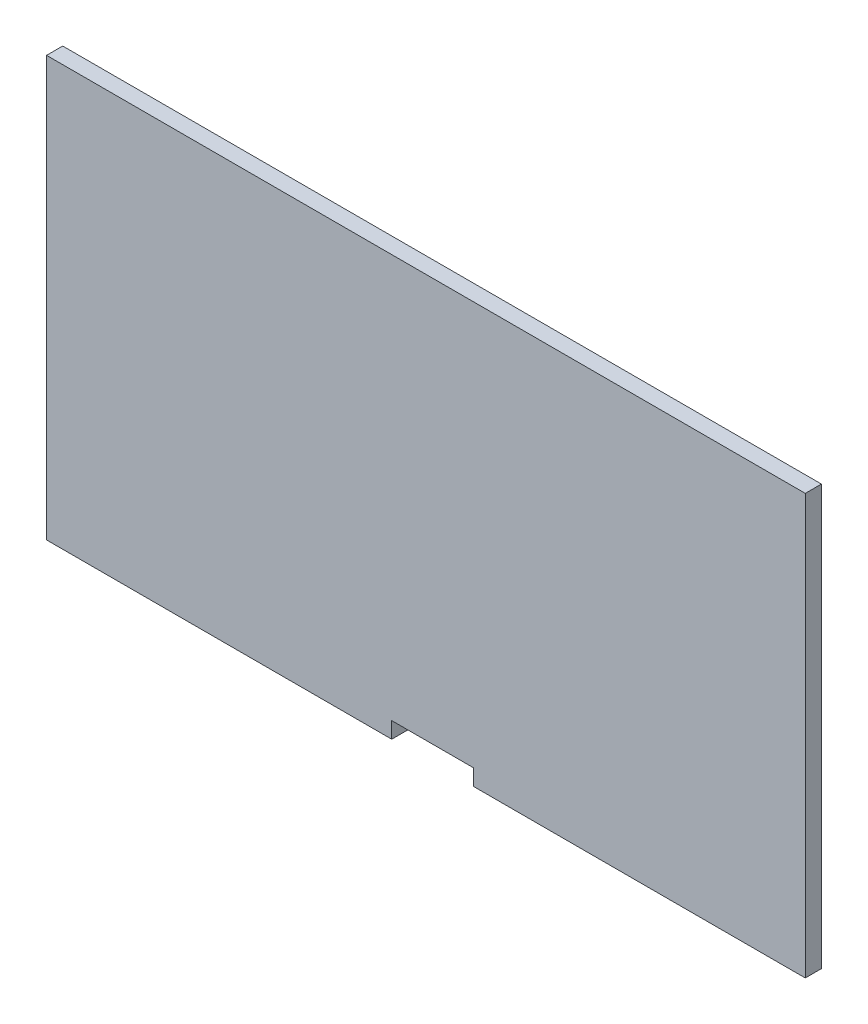
ISO-10303-21;
HEADER;
FILE_DESCRIPTION(('STEP AP214'),'2;1');
FILE_NAME('part.step','',(''),(''),'','','');
FILE_SCHEMA(('AUTOMOTIVE_DESIGN { 1 0 10303 214 1 1 1 1 }'));
ENDSEC;
DATA;
#1=APPLICATION_CONTEXT('core data for automotive mechanical design processes');
#2=APPLICATION_PROTOCOL_DEFINITION('international standard','automotive_design',2000,#1);
#3=PRODUCT_CONTEXT('',#1,'mechanical');
#4=PRODUCT('Part','Part','',(#3));
#5=PRODUCT_RELATED_PRODUCT_CATEGORY('part','',(#4));
#6=PRODUCT_DEFINITION_FORMATION('','',#4);
#7=PRODUCT_DEFINITION_CONTEXT('part definition',#1,'design');
#8=PRODUCT_DEFINITION('design','',#6,#7);
#9=PRODUCT_DEFINITION_SHAPE('','',#8);
#10=(LENGTH_UNIT() NAMED_UNIT(*) SI_UNIT(.MILLI.,.METRE.));
#11=(NAMED_UNIT(*) PLANE_ANGLE_UNIT() SI_UNIT($,.RADIAN.));
#12=(NAMED_UNIT(*) SI_UNIT($,.STERADIAN.) SOLID_ANGLE_UNIT());
#13=UNCERTAINTY_MEASURE_WITH_UNIT(LENGTH_MEASURE(1.E-05),#10,'distance_accuracy_value','');
#14=(GEOMETRIC_REPRESENTATION_CONTEXT(3) GLOBAL_UNCERTAINTY_ASSIGNED_CONTEXT((#13)) GLOBAL_UNIT_ASSIGNED_CONTEXT((#10,
#11,#12)) REPRESENTATION_CONTEXT('',''));
#15=CARTESIAN_POINT('',(0.,0.,0.));
#16=DIRECTION('',(0.,0.,1.));
#17=DIRECTION('',(1.,0.,0.));
#18=AXIS2_PLACEMENT_3D('',#15,#16,#17);
#19=CARTESIAN_POINT('',(21.556960057255,0.,41.9590420054778));
#20=DIRECTION('',(1.,0.,0.));
#21=DIRECTION('',(0.,1.,0.));
#22=AXIS2_PLACEMENT_3D('',#19,#20,#21);
#23=PLANE('',#22);
#24=DIRECTION('',(0.,-1.,0.));
#25=VECTOR('',#24,1.);
#26=CARTESIAN_POINT('',(21.556960057255,0.,40.9590420054778));
#27=LINE('',#26,#25);
#28=CARTESIAN_POINT('',(21.556960057255,13.703029385592,40.9590420054778));
#29=VERTEX_POINT('',#28);
#30=CARTESIAN_POINT('',(21.556960057255,12.703029385592,40.9590420054778));
#31=VERTEX_POINT('',#30);
#32=EDGE_CURVE('E145',#29,#31,#27,.T.);
#33=ORIENTED_EDGE('',*,*,#32,.T.);
#34=DIRECTION('',(0.,0.,-1.));
#35=VECTOR('',#34,1.);
#36=CARTESIAN_POINT('',(21.556960057255,12.703029385592,41.9590420054778));
#37=LINE('',#36,#35);
#38=CARTESIAN_POINT('',(21.556960057255,12.703029385592,41.9590420054778));
#39=VERTEX_POINT('',#38);
#40=EDGE_CURVE('E41',#39,#31,#37,.T.);
#41=ORIENTED_EDGE('',*,*,#40,.F.);
#42=DIRECTION('',(0.,-1.,0.));
#43=VECTOR('',#42,1.);
#44=CARTESIAN_POINT('',(21.556960057255,0.,41.9590420054778));
#45=LINE('',#44,#43);
#46=CARTESIAN_POINT('',(21.556960057255,13.703029385592,41.9590420054778));
#47=VERTEX_POINT('',#46);
#48=EDGE_CURVE('E99',#47,#39,#45,.T.);
#49=ORIENTED_EDGE('',*,*,#48,.F.);
#50=DIRECTION('',(0.,0.,-1.));
#51=VECTOR('',#50,1.);
#52=CARTESIAN_POINT('',(21.556960057255,13.703029385592,41.9590420054778));
#53=LINE('',#52,#51);
#54=EDGE_CURVE('E11',#47,#29,#53,.T.);
#55=ORIENTED_EDGE('',*,*,#54,.T.);
#56=EDGE_LOOP('',(#33,#41,#49,#55));
#57=FACE_BOUND('',#56,.T.);
#58=ADVANCED_FACE('F33',(#57),#23,.F.);
#59=CARTESIAN_POINT('',(0.,12.703029385592,41.9590420054778));
#60=DIRECTION('',(0.,1.,0.));
#61=DIRECTION('',(0.,0.,1.));
#62=AXIS2_PLACEMENT_3D('',#59,#60,#61);
#63=PLANE('',#62);
#64=DIRECTION('',(1.,0.,0.));
#65=VECTOR('',#64,1.);
#66=CARTESIAN_POINT('',(0.,12.703029385592,40.9590420054778));
#67=LINE('',#66,#65);
#68=CARTESIAN_POINT('',(42.1130982354382,12.703029385592,40.9590420054778));
#69=VERTEX_POINT('',#68);
#70=EDGE_CURVE('E148',#31,#69,#67,.T.);
#71=ORIENTED_EDGE('',*,*,#70,.T.);
#72=DIRECTION('',(0.,0.,-1.));
#73=VECTOR('',#72,1.);
#74=CARTESIAN_POINT('',(42.1130982354382,12.703029385592,41.9590420054778));
#75=LINE('',#74,#73);
#76=CARTESIAN_POINT('',(42.1130982354382,12.703029385592,41.9590420054778));
#77=VERTEX_POINT('',#76);
#78=EDGE_CURVE('E175',#77,#69,#75,.T.);
#79=ORIENTED_EDGE('',*,*,#78,.F.);
#80=DIRECTION('',(1.,0.,0.));
#81=VECTOR('',#80,1.);
#82=CARTESIAN_POINT('',(0.,12.703029385592,41.9590420054778));
#83=LINE('',#82,#81);
#84=EDGE_CURVE('E183',#39,#77,#83,.T.);
#85=ORIENTED_EDGE('',*,*,#84,.F.);
#86=ORIENTED_EDGE('',*,*,#40,.T.);
#87=EDGE_LOOP('',(#71,#79,#85,#86));
#88=FACE_BOUND('',#87,.T.);
#89=ADVANCED_FACE('F181',(#88),#63,.F.);
#90=CARTESIAN_POINT('',(42.1130982354382,0.,41.9590420054778));
#91=DIRECTION('',(-1.,0.,0.));
#92=DIRECTION('',(0.,0.,1.));
#93=AXIS2_PLACEMENT_3D('',#90,#91,#92);
#94=PLANE('',#93);
#95=DIRECTION('',(0.,1.,0.));
#96=VECTOR('',#95,1.);
#97=CARTESIAN_POINT('',(42.1130982354382,0.,40.9590420054778));
#98=LINE('',#97,#96);
#99=CARTESIAN_POINT('',(42.1130982354382,38.703029385592,40.9590420054778));
#100=VERTEX_POINT('',#99);
#101=EDGE_CURVE('E150',#69,#100,#98,.T.);
#102=ORIENTED_EDGE('',*,*,#101,.T.);
#103=DIRECTION('',(0.,0.,-1.));
#104=VECTOR('',#103,1.);
#105=CARTESIAN_POINT('',(42.1130982354382,38.703029385592,41.9590420054778));
#106=LINE('',#105,#104);
#107=CARTESIAN_POINT('',(42.1130982354382,38.703029385592,41.9590420054778));
#108=VERTEX_POINT('',#107);
#109=EDGE_CURVE('E172',#108,#100,#106,.T.);
#110=ORIENTED_EDGE('',*,*,#109,.F.);
#111=DIRECTION('',(0.,1.,0.));
#112=VECTOR('',#111,1.);
#113=CARTESIAN_POINT('',(42.1130982354382,0.,41.9590420054778));
#114=LINE('',#113,#112);
#115=EDGE_CURVE('E193',#77,#108,#114,.T.);
#116=ORIENTED_EDGE('',*,*,#115,.F.);
#117=ORIENTED_EDGE('',*,*,#78,.T.);
#118=EDGE_LOOP('',(#102,#110,#116,#117));
#119=FACE_BOUND('',#118,.T.);
#120=ADVANCED_FACE('F189',(#119),#94,.F.);
#121=CARTESIAN_POINT('',(0.,38.703029385592,41.9590420054778));
#122=DIRECTION('',(0.,-1.,0.));
#123=DIRECTION('',(0.,0.,-1.));
#124=AXIS2_PLACEMENT_3D('',#121,#122,#123);
#125=PLANE('',#124);
#126=DIRECTION('',(-1.,0.,0.));
#127=VECTOR('',#126,1.);
#128=CARTESIAN_POINT('',(0.,38.703029385592,40.9590420054778));
#129=LINE('',#128,#127);
#130=CARTESIAN_POINT('',(-4.88690176456177,38.703029385592,40.9590420054778));
#131=VERTEX_POINT('',#130);
#132=EDGE_CURVE('E152',#100,#131,#129,.T.);
#133=ORIENTED_EDGE('',*,*,#132,.T.);
#134=DIRECTION('',(0.,0.,-1.));
#135=VECTOR('',#134,1.);
#136=CARTESIAN_POINT('',(-4.88690176456177,38.703029385592,41.9590420054778));
#137=LINE('',#136,#135);
#138=CARTESIAN_POINT('',(-4.88690176456177,38.703029385592,41.9590420054778));
#139=VERTEX_POINT('',#138);
#140=EDGE_CURVE('E134',#139,#131,#137,.T.);
#141=ORIENTED_EDGE('',*,*,#140,.F.);
#142=DIRECTION('',(-1.,0.,0.));
#143=VECTOR('',#142,1.);
#144=CARTESIAN_POINT('',(0.,38.703029385592,41.9590420054778));
#145=LINE('',#144,#143);
#146=EDGE_CURVE('E122',#108,#139,#145,.T.);
#147=ORIENTED_EDGE('',*,*,#146,.F.);
#148=ORIENTED_EDGE('',*,*,#109,.T.);
#149=EDGE_LOOP('',(#133,#141,#147,#148));
#150=FACE_BOUND('',#149,.T.);
#151=ADVANCED_FACE('F192',(#150),#125,.F.);
#152=CARTESIAN_POINT('',(-4.88690176456177,0.,41.9590420054778));
#153=DIRECTION('',(1.,0.,0.));
#154=DIRECTION('',(0.,0.,-1.));
#155=AXIS2_PLACEMENT_3D('',#152,#153,#154);
#156=PLANE('',#155);
#157=DIRECTION('',(0.,-1.,0.));
#158=VECTOR('',#157,1.);
#159=CARTESIAN_POINT('',(-4.88690176456177,0.,40.9590420054778));
#160=LINE('',#159,#158);
#161=CARTESIAN_POINT('',(-4.88690176456177,12.703029385592,40.9590420054778));
#162=VERTEX_POINT('',#161);
#163=EDGE_CURVE('E131',#131,#162,#160,.T.);
#164=ORIENTED_EDGE('',*,*,#163,.T.);
#165=DIRECTION('',(0.,0.,-1.));
#166=VECTOR('',#165,1.);
#167=CARTESIAN_POINT('',(-4.88690176456177,12.703029385592,41.9590420054778));
#168=LINE('',#167,#166);
#169=CARTESIAN_POINT('',(-4.88690176456177,12.703029385592,41.9590420054778));
#170=VERTEX_POINT('',#169);
#171=EDGE_CURVE('E128',#170,#162,#168,.T.);
#172=ORIENTED_EDGE('',*,*,#171,.F.);
#173=DIRECTION('',(0.,-1.,0.));
#174=VECTOR('',#173,1.);
#175=CARTESIAN_POINT('',(-4.88690176456177,0.,41.9590420054778));
#176=LINE('',#175,#174);
#177=EDGE_CURVE('E115',#139,#170,#176,.T.);
#178=ORIENTED_EDGE('',*,*,#177,.F.);
#179=ORIENTED_EDGE('',*,*,#140,.T.);
#180=EDGE_LOOP('',(#164,#172,#178,#179));
#181=FACE_BOUND('',#180,.T.);
#182=ADVANCED_FACE('F129',(#181),#156,.F.);
#183=CARTESIAN_POINT('',(0.,12.703029385592,41.9590420054778));
#184=DIRECTION('',(0.,1.,0.));
#185=DIRECTION('',(0.,0.,1.));
#186=AXIS2_PLACEMENT_3D('',#183,#184,#185);
#187=PLANE('',#186);
#188=DIRECTION('',(1.,0.,0.));
#189=VECTOR('',#188,1.);
#190=CARTESIAN_POINT('',(0.,12.703029385592,40.9590420054778));
#191=LINE('',#190,#189);
#192=CARTESIAN_POINT('',(16.4951045427233,12.703029385592,40.9590420054778));
#193=VERTEX_POINT('',#192);
#194=EDGE_CURVE('E155',#162,#193,#191,.T.);
#195=ORIENTED_EDGE('',*,*,#194,.T.);
#196=DIRECTION('',(0.,0.,-1.));
#197=VECTOR('',#196,1.);
#198=CARTESIAN_POINT('',(16.4951045427233,12.703029385592,41.9590420054778));
#199=LINE('',#198,#197);
#200=CARTESIAN_POINT('',(16.4951045427233,12.703029385592,41.9590420054778));
#201=VERTEX_POINT('',#200);
#202=EDGE_CURVE('E135',#201,#193,#199,.T.);
#203=ORIENTED_EDGE('',*,*,#202,.F.);
#204=DIRECTION('',(1.,0.,0.));
#205=VECTOR('',#204,1.);
#206=CARTESIAN_POINT('',(0.,12.703029385592,41.9590420054778));
#207=LINE('',#206,#205);
#208=EDGE_CURVE('E119',#170,#201,#207,.T.);
#209=ORIENTED_EDGE('',*,*,#208,.F.);
#210=ORIENTED_EDGE('',*,*,#171,.T.);
#211=EDGE_LOOP('',(#195,#203,#209,#210));
#212=FACE_BOUND('',#211,.T.);
#213=ADVANCED_FACE('F137',(#212),#187,.F.);
#214=CARTESIAN_POINT('',(16.4951045427233,0.,41.9590420054778));
#215=DIRECTION('',(-1.,0.,0.));
#216=DIRECTION('',(0.,-1.,0.));
#217=AXIS2_PLACEMENT_3D('',#214,#215,#216);
#218=PLANE('',#217);
#219=DIRECTION('',(0.,1.,0.));
#220=VECTOR('',#219,1.);
#221=CARTESIAN_POINT('',(16.4951045427233,0.,40.9590420054778));
#222=LINE('',#221,#220);
#223=CARTESIAN_POINT('',(16.4951045427232,13.703029385592,40.9590420054778));
#224=VERTEX_POINT('',#223);
#225=EDGE_CURVE('E157',#193,#224,#222,.T.);
#226=ORIENTED_EDGE('',*,*,#225,.T.);
#227=DIRECTION('',(0.,0.,-1.));
#228=VECTOR('',#227,1.);
#229=CARTESIAN_POINT('',(16.4951045427232,13.703029385592,41.9590420054778));
#230=LINE('',#229,#228);
#231=CARTESIAN_POINT('',(16.4951045427232,13.703029385592,41.9590420054778));
#232=VERTEX_POINT('',#231);
#233=EDGE_CURVE('E140',#232,#224,#230,.T.);
#234=ORIENTED_EDGE('',*,*,#233,.F.);
#235=DIRECTION('',(0.,1.,0.));
#236=VECTOR('',#235,1.);
#237=CARTESIAN_POINT('',(16.4951045427233,0.,41.9590420054778));
#238=LINE('',#237,#236);
#239=EDGE_CURVE('E49',#201,#232,#238,.T.);
#240=ORIENTED_EDGE('',*,*,#239,.F.);
#241=ORIENTED_EDGE('',*,*,#202,.T.);
#242=EDGE_LOOP('',(#226,#234,#240,#241));
#243=FACE_BOUND('',#242,.T.);
#244=ADVANCED_FACE('F251',(#243),#218,.F.);
#245=CARTESIAN_POINT('',(0.,0.,41.9590420054778));
#246=DIRECTION('',(0.,0.,1.));
#247=DIRECTION('',(1.,0.,0.));
#248=AXIS2_PLACEMENT_3D('',#245,#246,#247);
#249=PLANE('',#248);
#250=ORIENTED_EDGE('',*,*,#239,.T.);
#251=DIRECTION('',(1.,0.,0.));
#252=VECTOR('',#251,1.);
#253=CARTESIAN_POINT('',(-3.88690176456177,13.703029385592,41.9590420054778));
#254=LINE('',#253,#252);
#255=EDGE_CURVE('E210',#232,#47,#254,.T.);
#256=ORIENTED_EDGE('',*,*,#255,.T.);
#257=ORIENTED_EDGE('',*,*,#48,.T.);
#258=ORIENTED_EDGE('',*,*,#84,.T.);
#259=ORIENTED_EDGE('',*,*,#115,.T.);
#260=ORIENTED_EDGE('',*,*,#146,.T.);
#261=ORIENTED_EDGE('',*,*,#177,.T.);
#262=ORIENTED_EDGE('',*,*,#208,.T.);
#263=EDGE_LOOP('',(#250,#256,#257,#258,#259,#260,#261,#262));
#264=FACE_BOUND('',#263,.T.);
#265=ADVANCED_FACE('F117',(#264),#249,.T.);
#266=CARTESIAN_POINT('',(0.,0.,40.9590420054778));
#267=DIRECTION('',(0.,0.,1.));
#268=DIRECTION('',(1.,0.,0.));
#269=AXIS2_PLACEMENT_3D('',#266,#267,#268);
#270=PLANE('',#269);
#271=DIRECTION('',(-1.,0.,0.));
#272=VECTOR('',#271,1.);
#273=CARTESIAN_POINT('',(0.,13.703029385592,40.9590420054778));
#274=LINE('',#273,#272);
#275=CARTESIAN_POINT('',(41.1130982354382,13.703029385592,40.9590420054778));
#276=VERTEX_POINT('',#275);
#277=EDGE_CURVE('E92',#276,#29,#274,.T.);
#278=ORIENTED_EDGE('',*,*,#277,.F.);
#279=DIRECTION('',(0.,-1.,0.));
#280=VECTOR('',#279,1.);
#281=CARTESIAN_POINT('',(41.1130982354382,0.,40.9590420054778));
#282=LINE('',#281,#280);
#283=CARTESIAN_POINT('',(41.1130982354382,37.703029385592,40.9590420054778));
#284=VERTEX_POINT('',#283);
#285=EDGE_CURVE('E87',#284,#276,#282,.T.);
#286=ORIENTED_EDGE('',*,*,#285,.F.);
#287=DIRECTION('',(1.,0.,0.));
#288=VECTOR('',#287,1.);
#289=CARTESIAN_POINT('',(0.,37.703029385592,40.9590420054778));
#290=LINE('',#289,#288);
#291=CARTESIAN_POINT('',(-3.88690176456177,37.703029385592,40.9590420054778));
#292=VERTEX_POINT('',#291);
#293=EDGE_CURVE('E165',#292,#284,#290,.T.);
#294=ORIENTED_EDGE('',*,*,#293,.F.);
#295=DIRECTION('',(0.,1.,0.));
#296=VECTOR('',#295,1.);
#297=CARTESIAN_POINT('',(-3.88690176456177,0.,40.9590420054778));
#298=LINE('',#297,#296);
#299=CARTESIAN_POINT('',(-3.88690176456177,13.703029385592,40.9590420054778));
#300=VERTEX_POINT('',#299);
#301=EDGE_CURVE('E162',#300,#292,#298,.T.);
#302=ORIENTED_EDGE('',*,*,#301,.F.);
#303=DIRECTION('',(-1.,0.,0.));
#304=VECTOR('',#303,1.);
#305=CARTESIAN_POINT('',(0.,13.703029385592,40.9590420054778));
#306=LINE('',#305,#304);
#307=EDGE_CURVE('E159',#224,#300,#306,.T.);
#308=ORIENTED_EDGE('',*,*,#307,.F.);
#309=ORIENTED_EDGE('',*,*,#225,.F.);
#310=ORIENTED_EDGE('',*,*,#194,.F.);
#311=ORIENTED_EDGE('',*,*,#163,.F.);
#312=ORIENTED_EDGE('',*,*,#132,.F.);
#313=ORIENTED_EDGE('',*,*,#101,.F.);
#314=ORIENTED_EDGE('',*,*,#70,.F.);
#315=ORIENTED_EDGE('',*,*,#32,.F.);
#316=EDGE_LOOP('',(#278,#286,#294,#302,#308,#309,#310,#311,#312,#313,#314,#315));
#317=FACE_BOUND('',#316,.T.);
#318=ADVANCED_FACE('F185',(#317),#270,.F.);
#319=CARTESIAN_POINT('',(-3.88690176456177,37.703029385592,39.9590420054778));
#320=DIRECTION('',(-1.,0.,0.));
#321=DIRECTION('',(0.,0.,1.));
#322=AXIS2_PLACEMENT_3D('',#319,#320,#321);
#323=PLANE('',#322);
#324=ORIENTED_EDGE('',*,*,#301,.T.);
#325=DIRECTION('',(0.,0.,1.));
#326=VECTOR('',#325,1.);
#327=CARTESIAN_POINT('',(-3.88690176456177,37.703029385592,39.9590420054778));
#328=LINE('',#327,#326);
#329=CARTESIAN_POINT('',(-3.88690176456177,37.703029385592,39.9590420054778));
#330=VERTEX_POINT('',#329);
#331=EDGE_CURVE('E146',#330,#292,#328,.T.);
#332=ORIENTED_EDGE('',*,*,#331,.F.);
#333=DIRECTION('',(0.,-1.,0.));
#334=VECTOR('',#333,1.);
#335=CARTESIAN_POINT('',(-3.88690176456177,37.703029385592,39.9590420054778));
#336=LINE('',#335,#334);
#337=CARTESIAN_POINT('',(-3.88690176456177,13.703029385592,39.9590420054778));
#338=VERTEX_POINT('',#337);
#339=EDGE_CURVE('E212',#330,#338,#336,.T.);
#340=ORIENTED_EDGE('',*,*,#339,.T.);
#341=DIRECTION('',(0.,0.,1.));
#342=VECTOR('',#341,1.);
#343=CARTESIAN_POINT('',(-3.88690176456177,13.703029385592,39.9590420054778));
#344=LINE('',#343,#342);
#345=EDGE_CURVE('E198',#338,#300,#344,.T.);
#346=ORIENTED_EDGE('',*,*,#345,.T.);
#347=EDGE_LOOP('',(#324,#332,#340,#346));
#348=FACE_BOUND('',#347,.T.);
#349=ADVANCED_FACE('F226',(#348),#323,.T.);
#350=CARTESIAN_POINT('',(-3.88690176456177,37.703029385592,39.9590420054778));
#351=DIRECTION('',(0.,1.,0.));
#352=DIRECTION('',(0.,0.,1.));
#353=AXIS2_PLACEMENT_3D('',#350,#351,#352);
#354=PLANE('',#353);
#355=ORIENTED_EDGE('',*,*,#293,.T.);
#356=DIRECTION('',(0.,0.,1.));
#357=VECTOR('',#356,1.);
#358=CARTESIAN_POINT('',(41.1130982354382,37.703029385592,39.9590420054778));
#359=LINE('',#358,#357);
#360=CARTESIAN_POINT('',(41.1130982354382,37.703029385592,39.9590420054778));
#361=VERTEX_POINT('',#360);
#362=EDGE_CURVE('E205',#361,#284,#359,.T.);
#363=ORIENTED_EDGE('',*,*,#362,.F.);
#364=DIRECTION('',(-1.,0.,0.));
#365=VECTOR('',#364,1.);
#366=CARTESIAN_POINT('',(-3.88690176456177,37.703029385592,39.9590420054778));
#367=LINE('',#366,#365);
#368=EDGE_CURVE('E202',#361,#330,#367,.T.);
#369=ORIENTED_EDGE('',*,*,#368,.T.);
#370=ORIENTED_EDGE('',*,*,#331,.T.);
#371=EDGE_LOOP('',(#355,#363,#369,#370));
#372=FACE_BOUND('',#371,.T.);
#373=ADVANCED_FACE('F239',(#372),#354,.T.);
#374=CARTESIAN_POINT('',(41.1130982354382,37.703029385592,39.9590420054778));
#375=DIRECTION('',(1.,0.,0.));
#376=DIRECTION('',(0.,0.,-1.));
#377=AXIS2_PLACEMENT_3D('',#374,#375,#376);
#378=PLANE('',#377);
#379=ORIENTED_EDGE('',*,*,#285,.T.);
#380=DIRECTION('',(0.,0.,1.));
#381=VECTOR('',#380,1.);
#382=CARTESIAN_POINT('',(41.1130982354382,13.703029385592,39.9590420054778));
#383=LINE('',#382,#381);
#384=CARTESIAN_POINT('',(41.1130982354382,13.703029385592,39.9590420054778));
#385=VERTEX_POINT('',#384);
#386=EDGE_CURVE('E201',#385,#276,#383,.T.);
#387=ORIENTED_EDGE('',*,*,#386,.F.);
#388=DIRECTION('',(0.,1.,0.));
#389=VECTOR('',#388,1.);
#390=CARTESIAN_POINT('',(41.1130982354382,37.703029385592,39.9590420054778));
#391=LINE('',#390,#389);
#392=EDGE_CURVE('E215',#385,#361,#391,.T.);
#393=ORIENTED_EDGE('',*,*,#392,.T.);
#394=ORIENTED_EDGE('',*,*,#362,.T.);
#395=EDGE_LOOP('',(#379,#387,#393,#394));
#396=FACE_BOUND('',#395,.T.);
#397=ADVANCED_FACE('F243',(#396),#378,.T.);
#398=CARTESIAN_POINT('',(-3.88690176456177,13.703029385592,39.9590420054778));
#399=DIRECTION('',(0.,-1.,0.));
#400=DIRECTION('',(0.,0.,-1.));
#401=AXIS2_PLACEMENT_3D('',#398,#399,#400);
#402=PLANE('',#401);
#403=ORIENTED_EDGE('',*,*,#233,.T.);
#404=ORIENTED_EDGE('',*,*,#307,.T.);
#405=ORIENTED_EDGE('',*,*,#345,.F.);
#406=DIRECTION('',(1.,0.,0.));
#407=VECTOR('',#406,1.);
#408=CARTESIAN_POINT('',(-3.88690176456177,13.703029385592,39.9590420054778));
#409=LINE('',#408,#407);
#410=EDGE_CURVE('E218',#338,#385,#409,.T.);
#411=ORIENTED_EDGE('',*,*,#410,.T.);
#412=ORIENTED_EDGE('',*,*,#386,.T.);
#413=ORIENTED_EDGE('',*,*,#277,.T.);
#414=ORIENTED_EDGE('',*,*,#54,.F.);
#415=ORIENTED_EDGE('',*,*,#255,.F.);
#416=EDGE_LOOP('',(#403,#404,#405,#411,#412,#413,#414,#415));
#417=FACE_BOUND('',#416,.T.);
#418=ADVANCED_FACE('F246',(#417),#402,.T.);
#419=CARTESIAN_POINT('',(0.,0.,39.9590420054778));
#420=DIRECTION('',(0.,0.,1.));
#421=DIRECTION('',(1.,0.,0.));
#422=AXIS2_PLACEMENT_3D('',#419,#420,#421);
#423=PLANE('',#422);
#424=ORIENTED_EDGE('',*,*,#339,.F.);
#425=ORIENTED_EDGE('',*,*,#368,.F.);
#426=ORIENTED_EDGE('',*,*,#392,.F.);
#427=ORIENTED_EDGE('',*,*,#410,.F.);
#428=EDGE_LOOP('',(#424,#425,#426,#427));
#429=FACE_BOUND('',#428,.T.);
#430=ADVANCED_FACE('F234',(#429),#423,.F.);
#431=CLOSED_SHELL('',(#58,#89,#120,#151,#182,#213,#244,#265,#318,#349,#373,#397,#418,#430));
#432=MANIFOLD_SOLID_BREP('B2',#431);
#433=ADVANCED_BREP_SHAPE_REPRESENTATION('',(#18,#432),#14);
#434=SHAPE_DEFINITION_REPRESENTATION(#9,#433);
ENDSEC;
END-ISO-10303-21;
